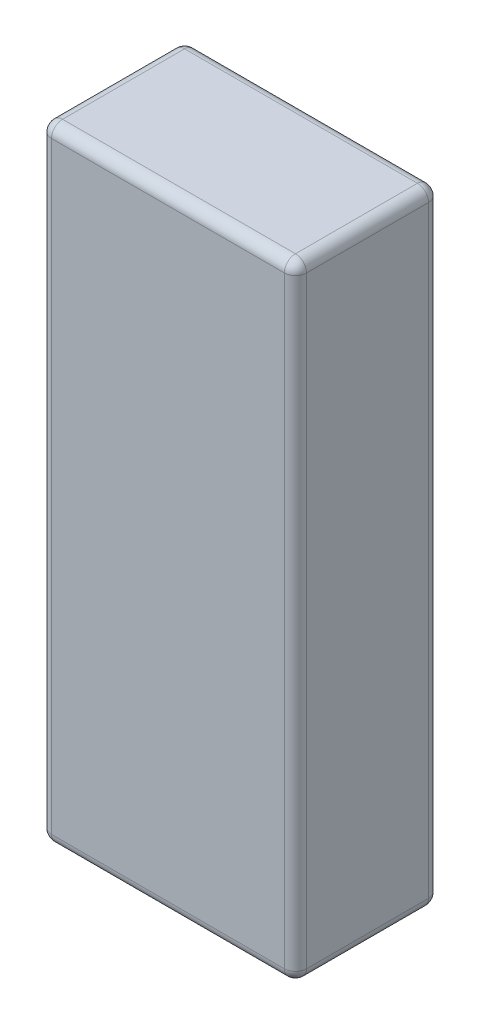
ISO-10303-21;
HEADER;
FILE_DESCRIPTION(('STEP AP214'),'2;1');
FILE_NAME('part.step','',(''),(''),'','','');
FILE_SCHEMA(('AUTOMOTIVE_DESIGN { 1 0 10303 214 1 1 1 1 }'));
ENDSEC;
DATA;
#1=APPLICATION_CONTEXT('core data for automotive mechanical design processes');
#2=APPLICATION_PROTOCOL_DEFINITION('international standard','automotive_design',2000,#1);
#3=PRODUCT_CONTEXT('',#1,'mechanical');
#4=PRODUCT('Part','Part','',(#3));
#5=PRODUCT_RELATED_PRODUCT_CATEGORY('part','',(#4));
#6=PRODUCT_DEFINITION_FORMATION('','',#4);
#7=PRODUCT_DEFINITION_CONTEXT('part definition',#1,'design');
#8=PRODUCT_DEFINITION('design','',#6,#7);
#9=PRODUCT_DEFINITION_SHAPE('','',#8);
#10=(LENGTH_UNIT() NAMED_UNIT(*) SI_UNIT(.MILLI.,.METRE.));
#11=(NAMED_UNIT(*) PLANE_ANGLE_UNIT() SI_UNIT($,.RADIAN.));
#12=(NAMED_UNIT(*) SI_UNIT($,.STERADIAN.) SOLID_ANGLE_UNIT());
#13=UNCERTAINTY_MEASURE_WITH_UNIT(LENGTH_MEASURE(1.E-05),#10,'distance_accuracy_value','');
#14=(GEOMETRIC_REPRESENTATION_CONTEXT(3) GLOBAL_UNCERTAINTY_ASSIGNED_CONTEXT((#13)) GLOBAL_UNIT_ASSIGNED_CONTEXT((#10,
#11,#12)) REPRESENTATION_CONTEXT('',''));
#15=CARTESIAN_POINT('',(0.,0.,0.));
#16=DIRECTION('',(0.,0.,1.));
#17=DIRECTION('',(1.,0.,0.));
#18=AXIS2_PLACEMENT_3D('',#15,#16,#17);
#19=CARTESIAN_POINT('',(34.5,-84.5,19.5));
#20=DIRECTION('',(-1.,0.,0.));
#21=DIRECTION('',(0.,0.,1.));
#22=AXIS2_PLACEMENT_3D('',#19,#20,#21);
#23=PLANE('',#22);
#24=DIRECTION('',(0.,1.,0.));
#25=VECTOR('',#24,1.);
#26=CARTESIAN_POINT('',(34.5,-84.5,16.5));
#27=LINE('',#26,#25);
#28=CARTESIAN_POINT('',(34.5,81.5,16.5));
#29=VERTEX_POINT('',#28);
#30=CARTESIAN_POINT('',(34.5,-81.5,16.5));
#31=VERTEX_POINT('',#30);
#32=EDGE_CURVE('E141',#29,#31,#27,.F.);
#33=ORIENTED_EDGE('',*,*,#32,.T.);
#34=DIRECTION('',(0.,0.,-1.));
#35=VECTOR('',#34,1.);
#36=CARTESIAN_POINT('',(34.5,-81.5,19.5));
#37=LINE('',#36,#35);
#38=CARTESIAN_POINT('',(34.5,-81.5,-16.5));
#39=VERTEX_POINT('',#38);
#40=EDGE_CURVE('E188',#31,#39,#37,.T.);
#41=ORIENTED_EDGE('',*,*,#40,.T.);
#42=DIRECTION('',(0.,1.,0.));
#43=VECTOR('',#42,1.);
#44=CARTESIAN_POINT('',(34.5,84.5,-16.5));
#45=LINE('',#44,#43);
#46=CARTESIAN_POINT('',(34.5,81.5,-16.5));
#47=VERTEX_POINT('',#46);
#48=EDGE_CURVE('E185',#39,#47,#45,.T.);
#49=ORIENTED_EDGE('',*,*,#48,.T.);
#50=DIRECTION('',(0.,0.,-1.));
#51=VECTOR('',#50,1.);
#52=CARTESIAN_POINT('',(34.5,81.5,19.5));
#53=LINE('',#52,#51);
#54=EDGE_CURVE('E183',#47,#29,#53,.F.);
#55=ORIENTED_EDGE('',*,*,#54,.T.);
#56=EDGE_LOOP('',(#33,#41,#49,#55));
#57=FACE_BOUND('',#56,.T.);
#58=ADVANCED_FACE('F34',(#57),#23,.F.);
#59=CARTESIAN_POINT('',(-34.5,84.5,19.5));
#60=DIRECTION('',(0.,-1.,0.));
#61=DIRECTION('',(0.,0.,-1.));
#62=AXIS2_PLACEMENT_3D('',#59,#60,#61);
#63=PLANE('',#62);
#64=DIRECTION('',(-1.,0.,0.));
#65=VECTOR('',#64,1.);
#66=CARTESIAN_POINT('',(-34.5,84.5,16.5));
#67=LINE('',#66,#65);
#68=CARTESIAN_POINT('',(-31.5,84.5,16.5));
#69=VERTEX_POINT('',#68);
#70=CARTESIAN_POINT('',(31.5,84.5,16.5));
#71=VERTEX_POINT('',#70);
#72=EDGE_CURVE('E43',#69,#71,#67,.F.);
#73=ORIENTED_EDGE('',*,*,#72,.T.);
#74=DIRECTION('',(0.,0.,-1.));
#75=VECTOR('',#74,1.);
#76=CARTESIAN_POINT('',(31.5,84.5,19.5));
#77=LINE('',#76,#75);
#78=CARTESIAN_POINT('',(31.5,84.5,-16.5));
#79=VERTEX_POINT('',#78);
#80=EDGE_CURVE('E11',#71,#79,#77,.T.);
#81=ORIENTED_EDGE('',*,*,#80,.T.);
#82=DIRECTION('',(-1.,0.,0.));
#83=VECTOR('',#82,1.);
#84=CARTESIAN_POINT('',(-34.5,84.5,-16.5));
#85=LINE('',#84,#83);
#86=CARTESIAN_POINT('',(-31.5,84.5,-16.5));
#87=VERTEX_POINT('',#86);
#88=EDGE_CURVE('E199',#79,#87,#85,.T.);
#89=ORIENTED_EDGE('',*,*,#88,.T.);
#90=DIRECTION('',(0.,0.,-1.));
#91=VECTOR('',#90,1.);
#92=CARTESIAN_POINT('',(-31.5,84.5,19.5));
#93=LINE('',#92,#91);
#94=EDGE_CURVE('E54',#87,#69,#93,.F.);
#95=ORIENTED_EDGE('',*,*,#94,.T.);
#96=EDGE_LOOP('',(#73,#81,#89,#95));
#97=FACE_BOUND('',#96,.T.);
#98=ADVANCED_FACE('F298',(#97),#63,.F.);
#99=CARTESIAN_POINT('',(-34.5,-84.5,19.5));
#100=DIRECTION('',(1.,0.,0.));
#101=DIRECTION('',(0.,0.,-1.));
#102=AXIS2_PLACEMENT_3D('',#99,#100,#101);
#103=PLANE('',#102);
#104=DIRECTION('',(0.,-1.,0.));
#105=VECTOR('',#104,1.);
#106=CARTESIAN_POINT('',(-34.5,-84.5,-16.5));
#107=LINE('',#106,#105);
#108=CARTESIAN_POINT('',(-34.5,81.5,-16.5));
#109=VERTEX_POINT('',#108);
#110=CARTESIAN_POINT('',(-34.5,-81.5,-16.5));
#111=VERTEX_POINT('',#110);
#112=EDGE_CURVE('E167',#109,#111,#107,.T.);
#113=ORIENTED_EDGE('',*,*,#112,.T.);
#114=DIRECTION('',(0.,0.,-1.));
#115=VECTOR('',#114,1.);
#116=CARTESIAN_POINT('',(-34.5,-81.5,19.5));
#117=LINE('',#116,#115);
#118=CARTESIAN_POINT('',(-34.5,-81.5,16.5));
#119=VERTEX_POINT('',#118);
#120=EDGE_CURVE('E172',#111,#119,#117,.F.);
#121=ORIENTED_EDGE('',*,*,#120,.T.);
#122=DIRECTION('',(0.,-1.,0.));
#123=VECTOR('',#122,1.);
#124=CARTESIAN_POINT('',(-34.5,-84.5,16.5));
#125=LINE('',#124,#123);
#126=CARTESIAN_POINT('',(-34.5,81.5,16.5));
#127=VERTEX_POINT('',#126);
#128=EDGE_CURVE('E169',#119,#127,#125,.F.);
#129=ORIENTED_EDGE('',*,*,#128,.T.);
#130=DIRECTION('',(0.,0.,-1.));
#131=VECTOR('',#130,1.);
#132=CARTESIAN_POINT('',(-34.5,81.5,19.5));
#133=LINE('',#132,#131);
#134=EDGE_CURVE('E165',#127,#109,#133,.T.);
#135=ORIENTED_EDGE('',*,*,#134,.T.);
#136=EDGE_LOOP('',(#113,#121,#129,#135));
#137=FACE_BOUND('',#136,.T.);
#138=ADVANCED_FACE('F303',(#137),#103,.F.);
#139=CARTESIAN_POINT('',(-34.5,-84.5,19.5));
#140=DIRECTION('',(0.,1.,0.));
#141=DIRECTION('',(0.,0.,1.));
#142=AXIS2_PLACEMENT_3D('',#139,#140,#141);
#143=PLANE('',#142);
#144=DIRECTION('',(1.,0.,0.));
#145=VECTOR('',#144,1.);
#146=CARTESIAN_POINT('',(-34.5,-84.5,16.5));
#147=LINE('',#146,#145);
#148=CARTESIAN_POINT('',(31.5,-84.5,16.5));
#149=VERTEX_POINT('',#148);
#150=CARTESIAN_POINT('',(-31.5,-84.5,16.5));
#151=VERTEX_POINT('',#150);
#152=EDGE_CURVE('E194',#149,#151,#147,.F.);
#153=ORIENTED_EDGE('',*,*,#152,.T.);
#154=DIRECTION('',(0.,0.,-1.));
#155=VECTOR('',#154,1.);
#156=CARTESIAN_POINT('',(-31.5,-84.5,19.5));
#157=LINE('',#156,#155);
#158=CARTESIAN_POINT('',(-31.5,-84.5,-16.5));
#159=VERTEX_POINT('',#158);
#160=EDGE_CURVE('E196',#151,#159,#157,.T.);
#161=ORIENTED_EDGE('',*,*,#160,.T.);
#162=DIRECTION('',(1.,0.,0.));
#163=VECTOR('',#162,1.);
#164=CARTESIAN_POINT('',(34.5,-84.5,-16.5));
#165=LINE('',#164,#163);
#166=CARTESIAN_POINT('',(31.5,-84.5,-16.5));
#167=VERTEX_POINT('',#166);
#168=EDGE_CURVE('E190',#159,#167,#165,.T.);
#169=ORIENTED_EDGE('',*,*,#168,.T.);
#170=DIRECTION('',(0.,0.,-1.));
#171=VECTOR('',#170,1.);
#172=CARTESIAN_POINT('',(31.5,-84.5,19.5));
#173=LINE('',#172,#171);
#174=EDGE_CURVE('E192',#167,#149,#173,.F.);
#175=ORIENTED_EDGE('',*,*,#174,.T.);
#176=EDGE_LOOP('',(#153,#161,#169,#175));
#177=FACE_BOUND('',#176,.T.);
#178=ADVANCED_FACE('F266',(#177),#143,.F.);
#179=CARTESIAN_POINT('',(0.,0.,19.5));
#180=DIRECTION('',(0.,0.,-1.));
#181=DIRECTION('',(-1.,0.,0.));
#182=AXIS2_PLACEMENT_3D('',#179,#180,#181);
#183=PLANE('',#182);
#184=DIRECTION('',(0.,-1.,0.));
#185=VECTOR('',#184,1.);
#186=CARTESIAN_POINT('',(-31.5,0.,19.5));
#187=LINE('',#186,#185);
#188=CARTESIAN_POINT('',(-31.5,81.5,19.5));
#189=VERTEX_POINT('',#188);
#190=CARTESIAN_POINT('',(-31.5,-81.5,19.5));
#191=VERTEX_POINT('',#190);
#192=EDGE_CURVE('E133',#189,#191,#187,.T.);
#193=ORIENTED_EDGE('',*,*,#192,.T.);
#194=DIRECTION('',(1.,0.,0.));
#195=VECTOR('',#194,1.);
#196=CARTESIAN_POINT('',(0.,-81.5,19.5));
#197=LINE('',#196,#195);
#198=CARTESIAN_POINT('',(31.5,-81.5,19.5));
#199=VERTEX_POINT('',#198);
#200=EDGE_CURVE('E129',#191,#199,#197,.T.);
#201=ORIENTED_EDGE('',*,*,#200,.T.);
#202=DIRECTION('',(0.,1.,0.));
#203=VECTOR('',#202,1.);
#204=CARTESIAN_POINT('',(31.5,0.,19.5));
#205=LINE('',#204,#203);
#206=CARTESIAN_POINT('',(31.5,81.5,19.5));
#207=VERTEX_POINT('',#206);
#208=EDGE_CURVE('E121',#199,#207,#205,.T.);
#209=ORIENTED_EDGE('',*,*,#208,.T.);
#210=DIRECTION('',(-1.,0.,0.));
#211=VECTOR('',#210,1.);
#212=CARTESIAN_POINT('',(0.,81.5,19.5));
#213=LINE('',#212,#211);
#214=EDGE_CURVE('E126',#207,#189,#213,.T.);
#215=ORIENTED_EDGE('',*,*,#214,.T.);
#216=EDGE_LOOP('',(#193,#201,#209,#215));
#217=FACE_BOUND('',#216,.T.);
#218=ADVANCED_FACE('F124',(#217),#183,.F.);
#219=CARTESIAN_POINT('',(0.,0.,-19.5));
#220=DIRECTION('',(0.,0.,-1.));
#221=DIRECTION('',(-1.,0.,0.));
#222=AXIS2_PLACEMENT_3D('',#219,#220,#221);
#223=PLANE('',#222);
#224=DIRECTION('',(0.,1.,0.));
#225=VECTOR('',#224,1.);
#226=CARTESIAN_POINT('',(31.5,-84.5,-19.5));
#227=LINE('',#226,#225);
#228=CARTESIAN_POINT('',(31.5,81.5,-19.5));
#229=VERTEX_POINT('',#228);
#230=CARTESIAN_POINT('',(31.5,-81.5,-19.5));
#231=VERTEX_POINT('',#230);
#232=EDGE_CURVE('E176',#229,#231,#227,.F.);
#233=ORIENTED_EDGE('',*,*,#232,.T.);
#234=DIRECTION('',(1.,0.,0.));
#235=VECTOR('',#234,1.);
#236=CARTESIAN_POINT('',(-34.5,-81.5,-19.5));
#237=LINE('',#236,#235);
#238=CARTESIAN_POINT('',(-31.5,-81.5,-19.5));
#239=VERTEX_POINT('',#238);
#240=EDGE_CURVE('E181',#231,#239,#237,.F.);
#241=ORIENTED_EDGE('',*,*,#240,.T.);
#242=DIRECTION('',(0.,-1.,0.));
#243=VECTOR('',#242,1.);
#244=CARTESIAN_POINT('',(-31.5,84.5,-19.5));
#245=LINE('',#244,#243);
#246=CARTESIAN_POINT('',(-31.5,81.5,-19.5));
#247=VERTEX_POINT('',#246);
#248=EDGE_CURVE('E178',#239,#247,#245,.F.);
#249=ORIENTED_EDGE('',*,*,#248,.T.);
#250=DIRECTION('',(-1.,0.,0.));
#251=VECTOR('',#250,1.);
#252=CARTESIAN_POINT('',(34.5,81.5,-19.5));
#253=LINE('',#252,#251);
#254=EDGE_CURVE('E174',#247,#229,#253,.F.);
#255=ORIENTED_EDGE('',*,*,#254,.T.);
#256=EDGE_LOOP('',(#233,#241,#249,#255));
#257=FACE_BOUND('',#256,.T.);
#258=ADVANCED_FACE('F275',(#257),#223,.T.);
#259=CARTESIAN_POINT('',(31.5,-84.5,-16.5));
#260=DIRECTION('',(0.,-1.,0.));
#261=DIRECTION('',(0.,0.,-1.));
#262=AXIS2_PLACEMENT_3D('',#259,#260,#261);
#263=CYLINDRICAL_SURFACE('',#262,3.);
#264=CARTESIAN_POINT('',(31.5,81.5,-16.5));
#265=DIRECTION('',(0.,1.,0.));
#266=DIRECTION('',(0.,0.,1.));
#267=AXIS2_PLACEMENT_3D('',#264,#265,#266);
#268=CIRCLE('',#267,3.);
#269=EDGE_CURVE('E38',#47,#229,#268,.T.);
#270=ORIENTED_EDGE('',*,*,#269,.F.);
#271=ORIENTED_EDGE('',*,*,#48,.F.);
#272=CARTESIAN_POINT('',(31.5,-81.5,-16.5));
#273=DIRECTION('',(0.,-1.,0.));
#274=DIRECTION('',(0.,0.,-1.));
#275=AXIS2_PLACEMENT_3D('',#272,#273,#274);
#276=CIRCLE('',#275,3.);
#277=EDGE_CURVE('E161',#231,#39,#276,.T.);
#278=ORIENTED_EDGE('',*,*,#277,.F.);
#279=ORIENTED_EDGE('',*,*,#232,.F.);
#280=EDGE_LOOP('',(#270,#271,#278,#279));
#281=FACE_BOUND('',#280,.T.);
#282=ADVANCED_FACE('F36',(#281),#263,.T.);
#283=CARTESIAN_POINT('',(31.5,81.5,-16.5));
#284=DIRECTION('',(0.,0.,1.));
#285=DIRECTION('',(1.,0.,0.));
#286=AXIS2_PLACEMENT_3D('',#283,#284,#285);
#287=SPHERICAL_SURFACE('',#286,3.);
#288=CARTESIAN_POINT('',(31.5,81.5,-16.5));
#289=DIRECTION('',(0.,0.,-1.));
#290=DIRECTION('',(-1.,0.,0.));
#291=AXIS2_PLACEMENT_3D('',#288,#289,#290);
#292=CIRCLE('',#291,3.);
#293=EDGE_CURVE('E244',#47,#79,#292,.F.);
#294=ORIENTED_EDGE('',*,*,#293,.F.);
#295=ORIENTED_EDGE('',*,*,#269,.T.);
#296=CARTESIAN_POINT('',(31.5,81.5,-16.5));
#297=DIRECTION('',(1.,0.,0.));
#298=DIRECTION('',(0.,0.,-1.));
#299=AXIS2_PLACEMENT_3D('',#296,#297,#298);
#300=CIRCLE('',#299,3.);
#301=EDGE_CURVE('E247',#79,#229,#300,.F.);
#302=ORIENTED_EDGE('',*,*,#301,.F.);
#303=EDGE_LOOP('',(#294,#295,#302));
#304=FACE_BOUND('',#303,.T.);
#305=ADVANCED_FACE('F292',(#304),#287,.T.);
#306=CARTESIAN_POINT('',(31.5,-81.5,-16.5));
#307=DIRECTION('',(0.,0.,1.));
#308=DIRECTION('',(1.,0.,0.));
#309=AXIS2_PLACEMENT_3D('',#306,#307,#308);
#310=SPHERICAL_SURFACE('',#309,3.);
#311=CARTESIAN_POINT('',(31.5,-81.5,-16.5));
#312=DIRECTION('',(1.,0.,0.));
#313=DIRECTION('',(0.,0.,-1.));
#314=AXIS2_PLACEMENT_3D('',#311,#312,#313);
#315=CIRCLE('',#314,3.);
#316=EDGE_CURVE('E238',#231,#167,#315,.F.);
#317=ORIENTED_EDGE('',*,*,#316,.F.);
#318=ORIENTED_EDGE('',*,*,#277,.T.);
#319=CARTESIAN_POINT('',(31.5,-81.5,-16.5));
#320=DIRECTION('',(0.,0.,-1.));
#321=DIRECTION('',(-1.,0.,0.));
#322=AXIS2_PLACEMENT_3D('',#319,#320,#321);
#323=CIRCLE('',#322,3.);
#324=EDGE_CURVE('E241',#167,#39,#323,.F.);
#325=ORIENTED_EDGE('',*,*,#324,.F.);
#326=EDGE_LOOP('',(#317,#318,#325));
#327=FACE_BOUND('',#326,.T.);
#328=ADVANCED_FACE('F254',(#327),#310,.T.);
#329=CARTESIAN_POINT('',(-34.5,81.5,-16.5));
#330=DIRECTION('',(1.,0.,0.));
#331=DIRECTION('',(0.,0.,-1.));
#332=AXIS2_PLACEMENT_3D('',#329,#330,#331);
#333=CYLINDRICAL_SURFACE('',#332,3.);
#334=ORIENTED_EDGE('',*,*,#301,.T.);
#335=ORIENTED_EDGE('',*,*,#254,.F.);
#336=CARTESIAN_POINT('',(-31.5,81.5,-16.5));
#337=DIRECTION('',(-1.,0.,0.));
#338=DIRECTION('',(0.,0.,1.));
#339=AXIS2_PLACEMENT_3D('',#336,#337,#338);
#340=CIRCLE('',#339,3.);
#341=EDGE_CURVE('E233',#87,#247,#340,.T.);
#342=ORIENTED_EDGE('',*,*,#341,.F.);
#343=ORIENTED_EDGE('',*,*,#88,.F.);
#344=EDGE_LOOP('',(#334,#335,#342,#343));
#345=FACE_BOUND('',#344,.T.);
#346=ADVANCED_FACE('F287',(#345),#333,.T.);
#347=CARTESIAN_POINT('',(31.5,81.5,19.5));
#348=DIRECTION('',(0.,0.,-1.));
#349=DIRECTION('',(-1.,0.,0.));
#350=AXIS2_PLACEMENT_3D('',#347,#348,#349);
#351=CYLINDRICAL_SURFACE('',#350,3.);
#352=ORIENTED_EDGE('',*,*,#293,.T.);
#353=ORIENTED_EDGE('',*,*,#80,.F.);
#354=CARTESIAN_POINT('',(31.5,81.5,16.5));
#355=DIRECTION('',(0.,0.,1.));
#356=DIRECTION('',(1.,0.,0.));
#357=AXIS2_PLACEMENT_3D('',#354,#355,#356);
#358=CIRCLE('',#357,3.);
#359=EDGE_CURVE('E145',#29,#71,#358,.T.);
#360=ORIENTED_EDGE('',*,*,#359,.F.);
#361=ORIENTED_EDGE('',*,*,#54,.F.);
#362=EDGE_LOOP('',(#352,#353,#360,#361));
#363=FACE_BOUND('',#362,.T.);
#364=ADVANCED_FACE('F295',(#363),#351,.T.);
#365=CARTESIAN_POINT('',(31.5,0.,16.5));
#366=DIRECTION('',(0.,1.,0.));
#367=DIRECTION('',(0.,0.,1.));
#368=AXIS2_PLACEMENT_3D('',#365,#366,#367);
#369=CYLINDRICAL_SURFACE('',#368,3.);
#370=CARTESIAN_POINT('',(31.5,-81.5,16.5));
#371=DIRECTION('',(0.,-1.,0.));
#372=DIRECTION('',(0.,0.,-1.));
#373=AXIS2_PLACEMENT_3D('',#370,#371,#372);
#374=CIRCLE('',#373,3.);
#375=EDGE_CURVE('E146',#31,#199,#374,.T.);
#376=ORIENTED_EDGE('',*,*,#375,.F.);
#377=ORIENTED_EDGE('',*,*,#32,.F.);
#378=CARTESIAN_POINT('',(31.5,81.5,16.5));
#379=DIRECTION('',(0.,1.,0.));
#380=DIRECTION('',(0.,0.,1.));
#381=AXIS2_PLACEMENT_3D('',#378,#379,#380);
#382=CIRCLE('',#381,3.);
#383=EDGE_CURVE('E137',#207,#29,#382,.T.);
#384=ORIENTED_EDGE('',*,*,#383,.F.);
#385=ORIENTED_EDGE('',*,*,#208,.F.);
#386=EDGE_LOOP('',(#376,#377,#384,#385));
#387=FACE_BOUND('',#386,.T.);
#388=ADVANCED_FACE('F139',(#387),#369,.T.);
#389=CARTESIAN_POINT('',(31.5,-81.5,19.5));
#390=DIRECTION('',(0.,0.,-1.));
#391=DIRECTION('',(-1.,0.,0.));
#392=AXIS2_PLACEMENT_3D('',#389,#390,#391);
#393=CYLINDRICAL_SURFACE('',#392,3.);
#394=ORIENTED_EDGE('',*,*,#324,.T.);
#395=ORIENTED_EDGE('',*,*,#40,.F.);
#396=CARTESIAN_POINT('',(31.5,-81.5,16.5));
#397=DIRECTION('',(0.,0.,1.));
#398=DIRECTION('',(1.,0.,0.));
#399=AXIS2_PLACEMENT_3D('',#396,#397,#398);
#400=CIRCLE('',#399,3.);
#401=EDGE_CURVE('E229',#149,#31,#400,.T.);
#402=ORIENTED_EDGE('',*,*,#401,.F.);
#403=ORIENTED_EDGE('',*,*,#174,.F.);
#404=EDGE_LOOP('',(#394,#395,#402,#403));
#405=FACE_BOUND('',#404,.T.);
#406=ADVANCED_FACE('F262',(#405),#393,.T.);
#407=CARTESIAN_POINT('',(-34.5,-81.5,-16.5));
#408=DIRECTION('',(-1.,0.,0.));
#409=DIRECTION('',(0.,0.,1.));
#410=AXIS2_PLACEMENT_3D('',#407,#408,#409);
#411=CYLINDRICAL_SURFACE('',#410,3.);
#412=ORIENTED_EDGE('',*,*,#316,.T.);
#413=ORIENTED_EDGE('',*,*,#168,.F.);
#414=CARTESIAN_POINT('',(-31.5,-81.5,-16.5));
#415=DIRECTION('',(-1.,0.,0.));
#416=DIRECTION('',(0.,0.,1.));
#417=AXIS2_PLACEMENT_3D('',#414,#415,#416);
#418=CIRCLE('',#417,3.);
#419=EDGE_CURVE('E226',#239,#159,#418,.T.);
#420=ORIENTED_EDGE('',*,*,#419,.F.);
#421=ORIENTED_EDGE('',*,*,#240,.F.);
#422=EDGE_LOOP('',(#412,#413,#420,#421));
#423=FACE_BOUND('',#422,.T.);
#424=ADVANCED_FACE('F272',(#423),#411,.T.);
#425=CARTESIAN_POINT('',(-31.5,-84.5,-16.5));
#426=DIRECTION('',(0.,1.,0.));
#427=DIRECTION('',(0.,0.,1.));
#428=AXIS2_PLACEMENT_3D('',#425,#426,#427);
#429=CYLINDRICAL_SURFACE('',#428,3.);
#430=CARTESIAN_POINT('',(-31.5,81.5,-16.5));
#431=DIRECTION('',(0.,1.,0.));
#432=DIRECTION('',(0.,0.,1.));
#433=AXIS2_PLACEMENT_3D('',#430,#431,#432);
#434=CIRCLE('',#433,3.);
#435=EDGE_CURVE('E235',#247,#109,#434,.T.);
#436=ORIENTED_EDGE('',*,*,#435,.F.);
#437=ORIENTED_EDGE('',*,*,#248,.F.);
#438=CARTESIAN_POINT('',(-31.5,-81.5,-16.5));
#439=DIRECTION('',(0.,-1.,0.));
#440=DIRECTION('',(0.,0.,-1.));
#441=AXIS2_PLACEMENT_3D('',#438,#439,#440);
#442=CIRCLE('',#441,3.);
#443=EDGE_CURVE('E223',#111,#239,#442,.T.);
#444=ORIENTED_EDGE('',*,*,#443,.F.);
#445=ORIENTED_EDGE('',*,*,#112,.F.);
#446=EDGE_LOOP('',(#436,#437,#444,#445));
#447=FACE_BOUND('',#446,.T.);
#448=ADVANCED_FACE('F279',(#447),#429,.T.);
#449=CARTESIAN_POINT('',(-31.5,81.5,-16.5));
#450=DIRECTION('',(0.,0.,1.));
#451=DIRECTION('',(1.,0.,0.));
#452=AXIS2_PLACEMENT_3D('',#449,#450,#451);
#453=SPHERICAL_SURFACE('',#452,3.);
#454=ORIENTED_EDGE('',*,*,#341,.T.);
#455=ORIENTED_EDGE('',*,*,#435,.T.);
#456=CARTESIAN_POINT('',(-31.5,81.5,-16.5));
#457=DIRECTION('',(0.,0.,-1.));
#458=DIRECTION('',(-1.,0.,0.));
#459=AXIS2_PLACEMENT_3D('',#456,#457,#458);
#460=CIRCLE('',#459,3.);
#461=EDGE_CURVE('E152',#87,#109,#460,.F.);
#462=ORIENTED_EDGE('',*,*,#461,.F.);
#463=EDGE_LOOP('',(#454,#455,#462));
#464=FACE_BOUND('',#463,.T.);
#465=ADVANCED_FACE('F343',(#464),#453,.T.);
#466=CARTESIAN_POINT('',(31.5,81.5,16.5));
#467=DIRECTION('',(0.,0.,1.));
#468=DIRECTION('',(1.,0.,0.));
#469=AXIS2_PLACEMENT_3D('',#466,#467,#468);
#470=SPHERICAL_SURFACE('',#469,3.);
#471=ORIENTED_EDGE('',*,*,#383,.T.);
#472=ORIENTED_EDGE('',*,*,#359,.T.);
#473=CARTESIAN_POINT('',(31.5,81.5,16.5));
#474=DIRECTION('',(1.,0.,0.));
#475=DIRECTION('',(0.,0.,-1.));
#476=AXIS2_PLACEMENT_3D('',#473,#474,#475);
#477=CIRCLE('',#476,3.);
#478=EDGE_CURVE('E149',#207,#71,#477,.F.);
#479=ORIENTED_EDGE('',*,*,#478,.F.);
#480=EDGE_LOOP('',(#471,#472,#479));
#481=FACE_BOUND('',#480,.T.);
#482=ADVANCED_FACE('F150',(#481),#470,.T.);
#483=CARTESIAN_POINT('',(31.5,-81.5,16.5));
#484=DIRECTION('',(0.,0.,1.));
#485=DIRECTION('',(1.,0.,0.));
#486=AXIS2_PLACEMENT_3D('',#483,#484,#485);
#487=SPHERICAL_SURFACE('',#486,3.);
#488=ORIENTED_EDGE('',*,*,#401,.T.);
#489=ORIENTED_EDGE('',*,*,#375,.T.);
#490=CARTESIAN_POINT('',(31.5,-81.5,16.5));
#491=DIRECTION('',(1.,0.,0.));
#492=DIRECTION('',(0.,0.,-1.));
#493=AXIS2_PLACEMENT_3D('',#490,#491,#492);
#494=CIRCLE('',#493,3.);
#495=EDGE_CURVE('E153',#149,#199,#494,.F.);
#496=ORIENTED_EDGE('',*,*,#495,.F.);
#497=EDGE_LOOP('',(#488,#489,#496));
#498=FACE_BOUND('',#497,.T.);
#499=ADVANCED_FACE('F336',(#498),#487,.T.);
#500=CARTESIAN_POINT('',(-31.5,-81.5,-16.5));
#501=DIRECTION('',(0.,0.,1.));
#502=DIRECTION('',(1.,0.,0.));
#503=AXIS2_PLACEMENT_3D('',#500,#501,#502);
#504=SPHERICAL_SURFACE('',#503,3.);
#505=ORIENTED_EDGE('',*,*,#443,.T.);
#506=ORIENTED_EDGE('',*,*,#419,.T.);
#507=CARTESIAN_POINT('',(-31.5,-81.5,-16.5));
#508=DIRECTION('',(0.,0.,-1.));
#509=DIRECTION('',(-1.,0.,0.));
#510=AXIS2_PLACEMENT_3D('',#507,#508,#509);
#511=CIRCLE('',#510,3.);
#512=EDGE_CURVE('E217',#111,#159,#511,.F.);
#513=ORIENTED_EDGE('',*,*,#512,.F.);
#514=EDGE_LOOP('',(#505,#506,#513));
#515=FACE_BOUND('',#514,.T.);
#516=ADVANCED_FACE('F332',(#515),#504,.T.);
#517=CARTESIAN_POINT('',(-31.5,81.5,19.5));
#518=DIRECTION('',(0.,0.,-1.));
#519=DIRECTION('',(-1.,0.,0.));
#520=AXIS2_PLACEMENT_3D('',#517,#518,#519);
#521=CYLINDRICAL_SURFACE('',#520,3.);
#522=ORIENTED_EDGE('',*,*,#461,.T.);
#523=ORIENTED_EDGE('',*,*,#134,.F.);
#524=CARTESIAN_POINT('',(-31.5,81.5,16.5));
#525=DIRECTION('',(0.,0.,1.));
#526=DIRECTION('',(1.,0.,0.));
#527=AXIS2_PLACEMENT_3D('',#524,#525,#526);
#528=CIRCLE('',#527,3.);
#529=EDGE_CURVE('E214',#69,#127,#528,.T.);
#530=ORIENTED_EDGE('',*,*,#529,.F.);
#531=ORIENTED_EDGE('',*,*,#94,.F.);
#532=EDGE_LOOP('',(#522,#523,#530,#531));
#533=FACE_BOUND('',#532,.T.);
#534=ADVANCED_FACE('F329',(#533),#521,.T.);
#535=CARTESIAN_POINT('',(0.,81.5,16.5));
#536=DIRECTION('',(-1.,0.,0.));
#537=DIRECTION('',(0.,0.,1.));
#538=AXIS2_PLACEMENT_3D('',#535,#536,#537);
#539=CYLINDRICAL_SURFACE('',#538,3.);
#540=ORIENTED_EDGE('',*,*,#478,.T.);
#541=ORIENTED_EDGE('',*,*,#72,.F.);
#542=CARTESIAN_POINT('',(-31.5,81.5,16.5));
#543=DIRECTION('',(-1.,0.,0.));
#544=DIRECTION('',(0.,0.,1.));
#545=AXIS2_PLACEMENT_3D('',#542,#543,#544);
#546=CIRCLE('',#545,3.);
#547=EDGE_CURVE('E157',#189,#69,#546,.T.);
#548=ORIENTED_EDGE('',*,*,#547,.F.);
#549=ORIENTED_EDGE('',*,*,#214,.F.);
#550=EDGE_LOOP('',(#540,#541,#548,#549));
#551=FACE_BOUND('',#550,.T.);
#552=ADVANCED_FACE('F155',(#551),#539,.T.);
#553=CARTESIAN_POINT('',(0.,-81.5,16.5));
#554=DIRECTION('',(1.,0.,0.));
#555=DIRECTION('',(0.,0.,-1.));
#556=AXIS2_PLACEMENT_3D('',#553,#554,#555);
#557=CYLINDRICAL_SURFACE('',#556,3.);
#558=ORIENTED_EDGE('',*,*,#495,.T.);
#559=ORIENTED_EDGE('',*,*,#200,.F.);
#560=CARTESIAN_POINT('',(-31.5,-81.5,16.5));
#561=DIRECTION('',(-1.,0.,0.));
#562=DIRECTION('',(0.,0.,1.));
#563=AXIS2_PLACEMENT_3D('',#560,#561,#562);
#564=CIRCLE('',#563,3.);
#565=EDGE_CURVE('E210',#151,#191,#564,.T.);
#566=ORIENTED_EDGE('',*,*,#565,.F.);
#567=ORIENTED_EDGE('',*,*,#152,.F.);
#568=EDGE_LOOP('',(#558,#559,#566,#567));
#569=FACE_BOUND('',#568,.T.);
#570=ADVANCED_FACE('F322',(#569),#557,.T.);
#571=CARTESIAN_POINT('',(-31.5,-81.5,19.5));
#572=DIRECTION('',(0.,0.,-1.));
#573=DIRECTION('',(-1.,0.,0.));
#574=AXIS2_PLACEMENT_3D('',#571,#572,#573);
#575=CYLINDRICAL_SURFACE('',#574,3.);
#576=ORIENTED_EDGE('',*,*,#512,.T.);
#577=ORIENTED_EDGE('',*,*,#160,.F.);
#578=CARTESIAN_POINT('',(-31.5,-81.5,16.5));
#579=DIRECTION('',(0.,0.,1.));
#580=DIRECTION('',(1.,0.,0.));
#581=AXIS2_PLACEMENT_3D('',#578,#579,#580);
#582=CIRCLE('',#581,3.);
#583=EDGE_CURVE('E207',#119,#151,#582,.T.);
#584=ORIENTED_EDGE('',*,*,#583,.F.);
#585=ORIENTED_EDGE('',*,*,#120,.F.);
#586=EDGE_LOOP('',(#576,#577,#584,#585));
#587=FACE_BOUND('',#586,.T.);
#588=ADVANCED_FACE('F318',(#587),#575,.T.);
#589=CARTESIAN_POINT('',(-31.5,81.5,16.5));
#590=DIRECTION('',(0.,0.,1.));
#591=DIRECTION('',(1.,0.,0.));
#592=AXIS2_PLACEMENT_3D('',#589,#590,#591);
#593=SPHERICAL_SURFACE('',#592,3.);
#594=ORIENTED_EDGE('',*,*,#547,.T.);
#595=ORIENTED_EDGE('',*,*,#529,.T.);
#596=CARTESIAN_POINT('',(-31.5,81.5,16.5));
#597=DIRECTION('',(0.,1.,0.));
#598=DIRECTION('',(0.,0.,1.));
#599=AXIS2_PLACEMENT_3D('',#596,#597,#598);
#600=CIRCLE('',#599,3.);
#601=EDGE_CURVE('E205',#189,#127,#600,.F.);
#602=ORIENTED_EDGE('',*,*,#601,.F.);
#603=EDGE_LOOP('',(#594,#595,#602));
#604=FACE_BOUND('',#603,.T.);
#605=ADVANCED_FACE('F314',(#604),#593,.T.);
#606=CARTESIAN_POINT('',(-31.5,-81.5,16.5));
#607=DIRECTION('',(0.,0.,1.));
#608=DIRECTION('',(1.,0.,0.));
#609=AXIS2_PLACEMENT_3D('',#606,#607,#608);
#610=SPHERICAL_SURFACE('',#609,3.);
#611=ORIENTED_EDGE('',*,*,#583,.T.);
#612=ORIENTED_EDGE('',*,*,#565,.T.);
#613=CARTESIAN_POINT('',(-31.5,-81.5,16.5));
#614=DIRECTION('',(0.,-1.,0.));
#615=DIRECTION('',(0.,0.,-1.));
#616=AXIS2_PLACEMENT_3D('',#613,#614,#615);
#617=CIRCLE('',#616,3.);
#618=EDGE_CURVE('E203',#119,#191,#617,.F.);
#619=ORIENTED_EDGE('',*,*,#618,.F.);
#620=EDGE_LOOP('',(#611,#612,#619));
#621=FACE_BOUND('',#620,.T.);
#622=ADVANCED_FACE('F310',(#621),#610,.T.);
#623=CARTESIAN_POINT('',(-31.5,0.,16.5));
#624=DIRECTION('',(0.,-1.,0.));
#625=DIRECTION('',(0.,0.,-1.));
#626=AXIS2_PLACEMENT_3D('',#623,#624,#625);
#627=CYLINDRICAL_SURFACE('',#626,3.);
#628=ORIENTED_EDGE('',*,*,#601,.T.);
#629=ORIENTED_EDGE('',*,*,#128,.F.);
#630=ORIENTED_EDGE('',*,*,#618,.T.);
#631=ORIENTED_EDGE('',*,*,#192,.F.);
#632=EDGE_LOOP('',(#628,#629,#630,#631));
#633=FACE_BOUND('',#632,.T.);
#634=ADVANCED_FACE('F307',(#633),#627,.T.);
#635=CLOSED_SHELL('',(#58,#98,#138,#178,#218,#258,#282,#305,#328,#346,#364,#388,#406,#424,#448,
#465,#482,#499,#516,#534,#552,#570,#588,#605,#622,#634));
#636=MANIFOLD_SOLID_BREP('B2',#635);
#637=ADVANCED_BREP_SHAPE_REPRESENTATION('',(#18,#636),#14);
#638=SHAPE_DEFINITION_REPRESENTATION(#9,#637);
ENDSEC;
END-ISO-10303-21;
